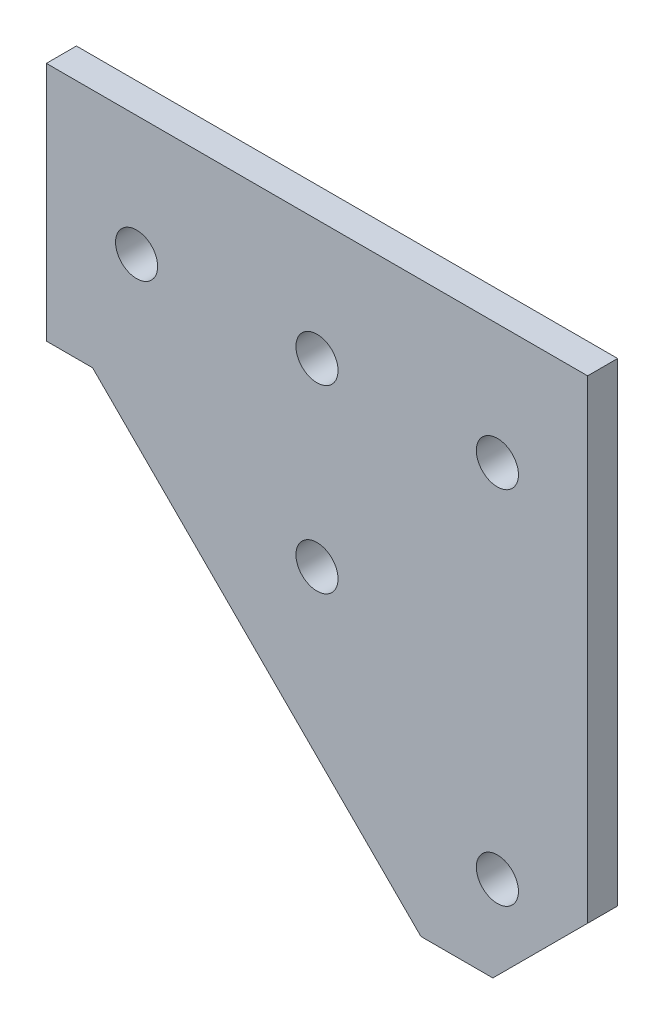
ISO-10303-21;
HEADER;
FILE_DESCRIPTION(('STEP AP214'),'2;1');
FILE_NAME('part.step','',(''),(''),'','','');
FILE_SCHEMA(('AUTOMOTIVE_DESIGN { 1 0 10303 214 1 1 1 1 }'));
ENDSEC;
DATA;
#1=APPLICATION_CONTEXT('core data for automotive mechanical design processes');
#2=APPLICATION_PROTOCOL_DEFINITION('international standard','automotive_design',2000,#1);
#3=PRODUCT_CONTEXT('',#1,'mechanical');
#4=PRODUCT('Part','Part','',(#3));
#5=PRODUCT_RELATED_PRODUCT_CATEGORY('part','',(#4));
#6=PRODUCT_DEFINITION_FORMATION('','',#4);
#7=PRODUCT_DEFINITION_CONTEXT('part definition',#1,'design');
#8=PRODUCT_DEFINITION('design','',#6,#7);
#9=PRODUCT_DEFINITION_SHAPE('','',#8);
#10=(LENGTH_UNIT() NAMED_UNIT(*) SI_UNIT(.MILLI.,.METRE.));
#11=(NAMED_UNIT(*) PLANE_ANGLE_UNIT() SI_UNIT($,.RADIAN.));
#12=(NAMED_UNIT(*) SI_UNIT($,.STERADIAN.) SOLID_ANGLE_UNIT());
#13=UNCERTAINTY_MEASURE_WITH_UNIT(LENGTH_MEASURE(1.E-05),#10,'distance_accuracy_value','');
#14=(GEOMETRIC_REPRESENTATION_CONTEXT(3) GLOBAL_UNCERTAINTY_ASSIGNED_CONTEXT((#13)) GLOBAL_UNIT_ASSIGNED_CONTEXT((#10,
#11,#12)) REPRESENTATION_CONTEXT('',''));
#15=CARTESIAN_POINT('',(0.,0.,0.));
#16=DIRECTION('',(0.,0.,1.));
#17=DIRECTION('',(1.,0.,0.));
#18=AXIS2_PLACEMENT_3D('',#15,#16,#17);
#19=CARTESIAN_POINT('',(0.,0.,2.49900007247925));
#20=DIRECTION('',(0.,0.,-1.));
#21=DIRECTION('',(-1.,0.,0.));
#22=AXIS2_PLACEMENT_3D('',#19,#20,#21);
#23=PLANE('',#22);
#24=CARTESIAN_POINT('',(15.0009994506836,-16.3500003814697,2.49900007247925));
#25=DIRECTION('',(0.,0.,1.));
#26=DIRECTION('',(1.,0.,0.));
#27=AXIS2_PLACEMENT_3D('',#24,#25,#26);
#28=CIRCLE('',#27,1.75);
#29=CARTESIAN_POINT('',(16.7509994506836,-16.3500003814697,2.49900007247925));
#30=VERTEX_POINT('',#29);
#31=EDGE_CURVE('E290',#30,#30,#28,.T.);
#32=ORIENTED_EDGE('',*,*,#31,.F.);
#33=EDGE_LOOP('',(#32));
#34=FACE_BOUND('',#33,.T.);
#35=CARTESIAN_POINT('',(15.0009994506836,13.6499996185303,2.49900007247925));
#36=DIRECTION('',(0.,0.,1.));
#37=DIRECTION('',(1.,0.,0.));
#38=AXIS2_PLACEMENT_3D('',#35,#36,#37);
#39=CIRCLE('',#38,1.75);
#40=CARTESIAN_POINT('',(16.7509994506836,13.6499996185303,2.49900007247925));
#41=VERTEX_POINT('',#40);
#42=EDGE_CURVE('E284',#41,#41,#39,.T.);
#43=ORIENTED_EDGE('',*,*,#42,.F.);
#44=EDGE_LOOP('',(#43));
#45=FACE_BOUND('',#44,.T.);
#46=CARTESIAN_POINT('',(0.000999450683597974,-1.35000038146973,2.49900007247925));
#47=DIRECTION('',(0.,0.,1.));
#48=DIRECTION('',(1.,0.,0.));
#49=AXIS2_PLACEMENT_3D('',#46,#47,#48);
#50=CIRCLE('',#49,1.75);
#51=CARTESIAN_POINT('',(1.7509994506836,-1.35000038146973,2.49900007247925));
#52=VERTEX_POINT('',#51);
#53=EDGE_CURVE('E278',#52,#52,#50,.T.);
#54=ORIENTED_EDGE('',*,*,#53,.F.);
#55=EDGE_LOOP('',(#54));
#56=FACE_BOUND('',#55,.T.);
#57=CARTESIAN_POINT('',(-14.9990005493164,13.6499996185303,2.49900007247925));
#58=DIRECTION('',(0.,0.,1.));
#59=DIRECTION('',(1.,0.,0.));
#60=AXIS2_PLACEMENT_3D('',#57,#58,#59);
#61=CIRCLE('',#60,1.75);
#62=CARTESIAN_POINT('',(-13.2490005493164,13.6499996185303,2.49900007247925));
#63=VERTEX_POINT('',#62);
#64=EDGE_CURVE('E272',#63,#63,#61,.T.);
#65=ORIENTED_EDGE('',*,*,#64,.F.);
#66=EDGE_LOOP('',(#65));
#67=FACE_BOUND('',#66,.T.);
#68=CARTESIAN_POINT('',(0.000999450683596137,13.6499996185303,2.49900007247925));
#69=DIRECTION('',(0.,0.,1.));
#70=DIRECTION('',(1.,0.,0.));
#71=AXIS2_PLACEMENT_3D('',#68,#69,#70);
#72=CIRCLE('',#71,1.75);
#73=CARTESIAN_POINT('',(1.7509994506836,13.6499996185303,2.49900007247925));
#74=VERTEX_POINT('',#73);
#75=EDGE_CURVE('E266',#74,#74,#72,.T.);
#76=ORIENTED_EDGE('',*,*,#75,.F.);
#77=EDGE_LOOP('',(#76));
#78=FACE_BOUND('',#77,.T.);
#79=DIRECTION('',(0.,1.,0.));
#80=VECTOR('',#79,1.);
#81=CARTESIAN_POINT('',(22.5009994506836,-15.7729997634888,2.49900007247925));
#82=LINE('',#81,#80);
#83=CARTESIAN_POINT('',(22.5009994506836,-15.7729997634888,2.49900007247925));
#84=VERTEX_POINT('',#83);
#85=CARTESIAN_POINT('',(22.5009994506836,23.6499996185303,2.49900007247925));
#86=VERTEX_POINT('',#85);
#87=EDGE_CURVE('E92',#84,#86,#82,.T.);
#88=ORIENTED_EDGE('',*,*,#87,.T.);
#89=DIRECTION('',(1.,0.,0.));
#90=VECTOR('',#89,1.);
#91=CARTESIAN_POINT('',(22.5009994506836,23.6499996185303,2.49900007247925));
#92=LINE('',#91,#90);
#93=CARTESIAN_POINT('',(-22.5009994506836,23.6499996185303,2.49900007247925));
#94=VERTEX_POINT('',#93);
#95=EDGE_CURVE('E245',#94,#86,#92,.T.);
#96=ORIENTED_EDGE('',*,*,#95,.F.);
#97=DIRECTION('',(0.,1.,0.));
#98=VECTOR('',#97,1.);
#99=CARTESIAN_POINT('',(-22.5009994506836,23.6499996185303,2.49900007247925));
#100=LINE('',#99,#98);
#101=CARTESIAN_POINT('',(-22.5009994506836,3.65000009536743,2.49900007247925));
#102=VERTEX_POINT('',#101);
#103=EDGE_CURVE('E262',#102,#94,#100,.T.);
#104=ORIENTED_EDGE('',*,*,#103,.F.);
#105=DIRECTION('',(1.,0.,0.));
#106=VECTOR('',#105,1.);
#107=CARTESIAN_POINT('',(-22.5009994506836,3.65000009536743,2.49900007247925));
#108=LINE('',#107,#106);
#109=CARTESIAN_POINT('',(-18.6580009460449,3.65000009536743,2.49900007247925));
#110=VERTEX_POINT('',#109);
#111=EDGE_CURVE('E126',#102,#110,#108,.T.);
#112=ORIENTED_EDGE('',*,*,#111,.T.);
#113=DIRECTION('',(-0.707093843447079,0.707119718689302,0.));
#114=VECTOR('',#113,1.);
#115=CARTESIAN_POINT('',(8.64099979400635,-23.6499996185303,2.49900007247925));
#116=LINE('',#115,#114);
#117=CARTESIAN_POINT('',(8.64099979400635,-23.6499996185303,2.49900007247925));
#118=VERTEX_POINT('',#117);
#119=EDGE_CURVE('E123',#118,#110,#116,.T.);
#120=ORIENTED_EDGE('',*,*,#119,.F.);
#121=DIRECTION('',(-1.,0.,0.));
#122=VECTOR('',#121,1.);
#123=CARTESIAN_POINT('',(14.6230001449585,-23.6499996185303,2.49900007247925));
#124=LINE('',#123,#122);
#125=CARTESIAN_POINT('',(14.6230001449585,-23.6499996185303,2.49900007247925));
#126=VERTEX_POINT('',#125);
#127=EDGE_CURVE('E108',#126,#118,#124,.T.);
#128=ORIENTED_EDGE('',*,*,#127,.F.);
#129=DIRECTION('',(-0.707151636532532,-0.707061922994982,0.));
#130=VECTOR('',#129,1.);
#131=CARTESIAN_POINT('',(22.5009994506836,-15.7729997634888,2.49900007247925));
#132=LINE('',#131,#130);
#133=EDGE_CURVE('E214',#84,#126,#132,.T.);
#134=ORIENTED_EDGE('',*,*,#133,.F.);
#135=EDGE_LOOP('',(#88,#96,#104,#112,#120,#128,#134));
#136=FACE_BOUND('',#135,.T.);
#137=ADVANCED_FACE('F38',(#34,#45,#56,#67,#78,#136),#23,.F.);
#138=CARTESIAN_POINT('',(0.,0.,0.00100000004749745));
#139=DIRECTION('',(0.,0.,1.));
#140=DIRECTION('',(1.,0.,0.));
#141=AXIS2_PLACEMENT_3D('',#138,#139,#140);
#142=PLANE('',#141);
#143=CARTESIAN_POINT('',(15.0009994506836,-16.3500003814697,0.0010000000474973));
#144=DIRECTION('',(0.,0.,1.));
#145=DIRECTION('',(1.,0.,0.));
#146=AXIS2_PLACEMENT_3D('',#143,#144,#145);
#147=CIRCLE('',#146,1.75);
#148=CARTESIAN_POINT('',(16.7509994506836,-16.3500003814697,0.0010000000474973));
#149=VERTEX_POINT('',#148);
#150=EDGE_CURVE('E287',#149,#149,#147,.T.);
#151=ORIENTED_EDGE('',*,*,#150,.T.);
#152=EDGE_LOOP('',(#151));
#153=FACE_BOUND('',#152,.T.);
#154=CARTESIAN_POINT('',(15.0009994506836,13.6499996185303,0.0010000000474973));
#155=DIRECTION('',(0.,0.,1.));
#156=DIRECTION('',(1.,0.,0.));
#157=AXIS2_PLACEMENT_3D('',#154,#155,#156);
#158=CIRCLE('',#157,1.75);
#159=CARTESIAN_POINT('',(16.7509994506836,13.6499996185303,0.0010000000474973));
#160=VERTEX_POINT('',#159);
#161=EDGE_CURVE('E281',#160,#160,#158,.T.);
#162=ORIENTED_EDGE('',*,*,#161,.T.);
#163=EDGE_LOOP('',(#162));
#164=FACE_BOUND('',#163,.T.);
#165=CARTESIAN_POINT('',(0.000999450683597974,-1.35000038146973,0.0010000000474973));
#166=DIRECTION('',(0.,0.,1.));
#167=DIRECTION('',(1.,0.,0.));
#168=AXIS2_PLACEMENT_3D('',#165,#166,#167);
#169=CIRCLE('',#168,1.75);
#170=CARTESIAN_POINT('',(1.7509994506836,-1.35000038146973,0.0010000000474973));
#171=VERTEX_POINT('',#170);
#172=EDGE_CURVE('E275',#171,#171,#169,.T.);
#173=ORIENTED_EDGE('',*,*,#172,.T.);
#174=EDGE_LOOP('',(#173));
#175=FACE_BOUND('',#174,.T.);
#176=CARTESIAN_POINT('',(-14.9990005493164,13.6499996185303,0.0010000000474973));
#177=DIRECTION('',(0.,0.,1.));
#178=DIRECTION('',(1.,0.,0.));
#179=AXIS2_PLACEMENT_3D('',#176,#177,#178);
#180=CIRCLE('',#179,1.75);
#181=CARTESIAN_POINT('',(-13.2490005493164,13.6499996185303,0.0010000000474973));
#182=VERTEX_POINT('',#181);
#183=EDGE_CURVE('E269',#182,#182,#180,.T.);
#184=ORIENTED_EDGE('',*,*,#183,.T.);
#185=EDGE_LOOP('',(#184));
#186=FACE_BOUND('',#185,.T.);
#187=CARTESIAN_POINT('',(0.000999450683596137,13.6499996185303,0.0010000000474973));
#188=DIRECTION('',(0.,0.,1.));
#189=DIRECTION('',(1.,0.,0.));
#190=AXIS2_PLACEMENT_3D('',#187,#188,#189);
#191=CIRCLE('',#190,1.75);
#192=CARTESIAN_POINT('',(1.7509994506836,13.6499996185303,0.0010000000474973));
#193=VERTEX_POINT('',#192);
#194=EDGE_CURVE('E265',#193,#193,#191,.T.);
#195=ORIENTED_EDGE('',*,*,#194,.T.);
#196=EDGE_LOOP('',(#195));
#197=FACE_BOUND('',#196,.T.);
#198=DIRECTION('',(0.707087188626439,-0.707126373203799,0.));
#199=VECTOR('',#198,1.);
#200=CARTESIAN_POINT('',(-18.6580009460449,3.65000009536743,0.00100000004749745));
#201=LINE('',#200,#199);
#202=CARTESIAN_POINT('',(-18.6580009460449,3.65000009536743,0.00100000004749744));
#203=VERTEX_POINT('',#202);
#204=CARTESIAN_POINT('',(-14.1610507965088,-0.847199261188507,0.00100000004749744));
#205=VERTEX_POINT('',#204);
#206=EDGE_CURVE('E198',#203,#205,#201,.T.);
#207=ORIENTED_EDGE('',*,*,#206,.F.);
#208=DIRECTION('',(1.,0.,0.));
#209=VECTOR('',#208,1.);
#210=CARTESIAN_POINT('',(-22.5009994506836,3.65000009536743,0.00100000004749744));
#211=LINE('',#210,#209);
#212=CARTESIAN_POINT('',(-22.5009994506836,3.65000009536743,0.00100000004749744));
#213=VERTEX_POINT('',#212);
#214=EDGE_CURVE('E250',#213,#203,#211,.T.);
#215=ORIENTED_EDGE('',*,*,#214,.F.);
#216=DIRECTION('',(0.,-1.,0.));
#217=VECTOR('',#216,1.);
#218=CARTESIAN_POINT('',(-22.5009994506836,3.65000009536743,0.00100000004749744));
#219=LINE('',#218,#217);
#220=CARTESIAN_POINT('',(-22.5009994506836,23.6499996185303,0.00100000004749745));
#221=VERTEX_POINT('',#220);
#222=EDGE_CURVE('E257',#221,#213,#219,.T.);
#223=ORIENTED_EDGE('',*,*,#222,.F.);
#224=DIRECTION('',(-1.,0.,0.));
#225=VECTOR('',#224,1.);
#226=CARTESIAN_POINT('',(-18.6580009460449,23.6499996185303,0.00100000004749745));
#227=LINE('',#226,#225);
#228=CARTESIAN_POINT('',(22.5009994506836,23.6499996185303,0.00100000004749743));
#229=VERTEX_POINT('',#228);
#230=EDGE_CURVE('E234',#229,#221,#227,.T.);
#231=ORIENTED_EDGE('',*,*,#230,.F.);
#232=DIRECTION('',(0.,1.,0.));
#233=VECTOR('',#232,1.);
#234=CARTESIAN_POINT('',(22.5009994506836,-15.7729997634888,0.00100000004749745));
#235=LINE('',#234,#233);
#236=CARTESIAN_POINT('',(22.5009994506836,-15.7729997634888,0.00100000004749743));
#237=VERTEX_POINT('',#236);
#238=EDGE_CURVE('E42',#237,#229,#235,.T.);
#239=ORIENTED_EDGE('',*,*,#238,.F.);
#240=DIRECTION('',(0.707151636532532,0.707061922994982,0.));
#241=VECTOR('',#240,1.);
#242=CARTESIAN_POINT('',(14.6230001449585,-23.6499996185303,0.00100000004749745));
#243=LINE('',#242,#241);
#244=CARTESIAN_POINT('',(14.6230001449585,-23.6499996185303,0.00100000004749741));
#245=VERTEX_POINT('',#244);
#246=EDGE_CURVE('E119',#245,#237,#243,.T.);
#247=ORIENTED_EDGE('',*,*,#246,.F.);
#248=DIRECTION('',(1.,0.,0.));
#249=VECTOR('',#248,1.);
#250=CARTESIAN_POINT('',(8.64099979400635,-23.6499996185303,0.00100000004749745));
#251=LINE('',#250,#249);
#252=CARTESIAN_POINT('',(8.64099979400635,-23.6499996185303,0.00100000004749743));
#253=VERTEX_POINT('',#252);
#254=EDGE_CURVE('E188',#253,#245,#251,.T.);
#255=ORIENTED_EDGE('',*,*,#254,.F.);
#256=DIRECTION('',(0.707055212201204,-0.707158346411262,0.));
#257=VECTOR('',#256,1.);
#258=CARTESIAN_POINT('',(6.93129014968872,-21.9400405883789,0.00100000004749745));
#259=LINE('',#258,#257);
#260=CARTESIAN_POINT('',(6.93129014968872,-21.9400405883789,0.00100000004749745));
#261=VERTEX_POINT('',#260);
#262=EDGE_CURVE('E139',#261,#253,#259,.T.);
#263=ORIENTED_EDGE('',*,*,#262,.F.);
#264=DIRECTION('',(0.707289456048854,-0.706924059119589,0.));
#265=VECTOR('',#264,1.);
#266=CARTESIAN_POINT('',(6.4494833946228,-21.4584827423096,0.00100000004749745));
#267=LINE('',#266,#265);
#268=CARTESIAN_POINT('',(6.4494833946228,-21.4584827423096,0.00100000004749741));
#269=VERTEX_POINT('',#268);
#270=EDGE_CURVE('E59',#269,#261,#267,.T.);
#271=ORIENTED_EDGE('',*,*,#270,.F.);
#272=DIRECTION('',(0.706819040544871,-0.707394404786487,0.));
#273=VECTOR('',#272,1.);
#274=CARTESIAN_POINT('',(6.08981370925903,-21.0985202789307,0.00100000004749745));
#275=LINE('',#274,#273);
#276=CARTESIAN_POINT('',(6.08981370925903,-21.0985202789307,0.00100000004749743));
#277=VERTEX_POINT('',#276);
#278=EDGE_CURVE('E12',#277,#269,#275,.T.);
#279=ORIENTED_EDGE('',*,*,#278,.F.);
#280=DIRECTION('',(0.707093827171199,-0.707119734964586,0.));
#281=VECTOR('',#280,1.);
#282=CARTESIAN_POINT('',(-13.1874361038208,-1.82056415081024,0.00100000004749745));
#283=LINE('',#282,#281);
#284=CARTESIAN_POINT('',(-13.1874361038208,-1.82056415081024,0.00100000004749744));
#285=VERTEX_POINT('',#284);
#286=EDGE_CURVE('E151',#285,#277,#283,.T.);
#287=ORIENTED_EDGE('',*,*,#286,.F.);
#288=DIRECTION('',(0.707197499194438,-0.70701605153853,0.));
#289=VECTOR('',#288,1.);
#290=CARTESIAN_POINT('',(-14.1610507965088,-0.847199261188507,0.00100000004749745));
#291=LINE('',#290,#289);
#292=EDGE_CURVE('E183',#205,#285,#291,.T.);
#293=ORIENTED_EDGE('',*,*,#292,.F.);
#294=EDGE_LOOP('',(#207,#215,#223,#231,#239,#247,#255,#263,#271,#279,#287,#293));
#295=FACE_BOUND('',#294,.T.);
#296=ADVANCED_FACE('F296',(#153,#164,#175,#186,#197,#295),#142,.F.);
#297=CARTESIAN_POINT('',(22.5009994506836,0.,0.));
#298=DIRECTION('',(1.,0.,0.));
#299=DIRECTION('',(0.,0.,-1.));
#300=AXIS2_PLACEMENT_3D('',#297,#298,#299);
#301=PLANE('',#300);
#302=ORIENTED_EDGE('',*,*,#238,.T.);
#303=DIRECTION('',(0.,0.,-1.));
#304=VECTOR('',#303,1.);
#305=CARTESIAN_POINT('',(22.5009994506836,23.6499996185303,0.00100000004749743));
#306=LINE('',#305,#304);
#307=EDGE_CURVE('E239',#86,#229,#306,.T.);
#308=ORIENTED_EDGE('',*,*,#307,.F.);
#309=ORIENTED_EDGE('',*,*,#87,.F.);
#310=DIRECTION('',(0.,0.,1.));
#311=VECTOR('',#310,1.);
#312=CARTESIAN_POINT('',(22.5009994506836,-15.7729997634888,0.00100000004749745));
#313=LINE('',#312,#311);
#314=EDGE_CURVE('E218',#237,#84,#313,.T.);
#315=ORIENTED_EDGE('',*,*,#314,.F.);
#316=EDGE_LOOP('',(#302,#308,#309,#315));
#317=FACE_BOUND('',#316,.T.);
#318=ADVANCED_FACE('F40',(#317),#301,.T.);
#319=CARTESIAN_POINT('',(19.13557214657,-19.138000109121,0.));
#320=DIRECTION('',(0.707061922994982,-0.707151636532532,0.));
#321=DIRECTION('',(0.707151636532532,0.707061922994982,0.));
#322=AXIS2_PLACEMENT_3D('',#319,#320,#321);
#323=PLANE('',#322);
#324=DIRECTION('',(0.,0.,1.));
#325=VECTOR('',#324,1.);
#326=CARTESIAN_POINT('',(14.6230001449585,-23.6499996185303,0.00100000004749745));
#327=LINE('',#326,#325);
#328=EDGE_CURVE('E116',#245,#126,#327,.T.);
#329=ORIENTED_EDGE('',*,*,#328,.F.);
#330=ORIENTED_EDGE('',*,*,#246,.T.);
#331=ORIENTED_EDGE('',*,*,#314,.T.);
#332=ORIENTED_EDGE('',*,*,#133,.T.);
#333=EDGE_LOOP('',(#329,#330,#331,#332));
#334=FACE_BOUND('',#333,.T.);
#335=ADVANCED_FACE('F342',(#334),#323,.T.);
#336=CARTESIAN_POINT('',(-7.50451739806725,-7.50410154405066,0.));
#337=DIRECTION('',(0.707126373203799,0.707087188626439,0.));
#338=DIRECTION('',(-0.707087188626439,0.707126373203799,0.));
#339=AXIS2_PLACEMENT_3D('',#336,#337,#338);
#340=PLANE('',#339);
#341=ORIENTED_EDGE('',*,*,#206,.T.);
#342=DIRECTION('',(0.658140144161474,-0.65817661624555,-0.365588693029027));
#343=VECTOR('',#342,1.);
#344=CARTESIAN_POINT('',(-18.6580009460449,3.65000009536743,2.49900007247925));
#345=LINE('',#344,#343);
#346=EDGE_CURVE('E187',#110,#205,#345,.T.);
#347=ORIENTED_EDGE('',*,*,#346,.F.);
#348=DIRECTION('',(0.,0.,-1.));
#349=VECTOR('',#348,1.);
#350=CARTESIAN_POINT('',(-18.6580009460449,3.65000009536743,2.49900007247925));
#351=LINE('',#350,#349);
#352=EDGE_CURVE('E193',#110,#203,#351,.T.);
#353=ORIENTED_EDGE('',*,*,#352,.T.);
#354=EDGE_LOOP('',(#341,#347,#353));
#355=FACE_BOUND('',#354,.T.);
#356=ADVANCED_FACE('F359',(#355),#340,.F.);
#357=CARTESIAN_POINT('',(0.,-23.6499996185303,0.));
#358=DIRECTION('',(0.,-1.,0.));
#359=DIRECTION('',(0.,0.,-1.));
#360=AXIS2_PLACEMENT_3D('',#357,#358,#359);
#361=PLANE('',#360);
#362=ORIENTED_EDGE('',*,*,#254,.T.);
#363=ORIENTED_EDGE('',*,*,#328,.T.);
#364=ORIENTED_EDGE('',*,*,#127,.T.);
#365=DIRECTION('',(0.,0.,1.));
#366=VECTOR('',#365,1.);
#367=CARTESIAN_POINT('',(8.64099979400635,-23.6499996185303,0.00100000004749745));
#368=LINE('',#367,#366);
#369=EDGE_CURVE('E113',#253,#118,#368,.T.);
#370=ORIENTED_EDGE('',*,*,#369,.F.);
#371=EDGE_LOOP('',(#362,#363,#364,#370));
#372=FACE_BOUND('',#371,.T.);
#373=ADVANCED_FACE('F111',(#372),#361,.T.);
#374=CARTESIAN_POINT('',(-7.5023072087039,-7.50423259081362,0.00421475360320862));
#375=DIRECTION('',(0.707015995767012,0.707197443408606,-0.000397197573064986));
#376=DIRECTION('',(-0.707197499194438,0.70701605153853,0.));
#377=AXIS2_PLACEMENT_3D('',#374,#375,#376);
#378=PLANE('',#377);
#379=ORIENTED_EDGE('',*,*,#292,.T.);
#380=DIRECTION('',(0.672900166017759,-0.672900092701792,-0.307263456686916));
#381=VECTOR('',#380,1.);
#382=CARTESIAN_POINT('',(-18.6580009460449,3.65000009536743,2.49900007247925));
#383=LINE('',#382,#381);
#384=EDGE_CURVE('E132',#110,#285,#383,.T.);
#385=ORIENTED_EDGE('',*,*,#384,.F.);
#386=ORIENTED_EDGE('',*,*,#346,.T.);
#387=EDGE_LOOP('',(#379,#385,#386));
#388=FACE_BOUND('',#387,.T.);
#389=ADVANCED_FACE('F353',(#388),#378,.F.);
#390=CARTESIAN_POINT('',(-7.5038696251632,-7.50277523708153,0.));
#391=DIRECTION('',(-0.707158346411262,-0.707055212201204,0.));
#392=DIRECTION('',(0.707055212201204,-0.707158346411262,0.));
#393=AXIS2_PLACEMENT_3D('',#390,#391,#392);
#394=PLANE('',#393);
#395=DIRECTION('',(0.491769759740235,-0.491841491459096,0.718508490335587));
#396=VECTOR('',#395,1.);
#397=CARTESIAN_POINT('',(6.93129014968872,-21.9400405883789,0.00100000004749745));
#398=LINE('',#397,#396);
#399=EDGE_CURVE('E138',#261,#118,#398,.T.);
#400=ORIENTED_EDGE('',*,*,#399,.F.);
#401=ORIENTED_EDGE('',*,*,#262,.T.);
#402=ORIENTED_EDGE('',*,*,#369,.T.);
#403=EDGE_LOOP('',(#400,#401,#402));
#404=FACE_BOUND('',#403,.T.);
#405=ADVANCED_FACE('F137',(#404),#394,.T.);
#406=CARTESIAN_POINT('',(-7.50616362555368,-7.51004343287379,-0.00340522105267804));
#407=DIRECTION('',(0.706924022766374,0.707289419676849,0.000320700784722148));
#408=DIRECTION('',(-0.707289456048854,0.706924059119589,0.));
#409=AXIS2_PLACEMENT_3D('',#406,#407,#408);
#410=PLANE('',#409);
#411=ORIENTED_EDGE('',*,*,#399,.T.);
#412=DIRECTION('',(0.550543733247143,-0.550543853036211,0.627537300617535));
#413=VECTOR('',#412,1.);
#414=CARTESIAN_POINT('',(6.4494833946228,-21.4584827423096,0.00100000004749745));
#415=LINE('',#414,#413);
#416=EDGE_CURVE('E145',#269,#118,#415,.T.);
#417=ORIENTED_EDGE('',*,*,#416,.F.);
#418=ORIENTED_EDGE('',*,*,#270,.T.);
#419=EDGE_LOOP('',(#411,#417,#418));
#420=FACE_BOUND('',#419,.T.);
#421=ADVANCED_FACE('F143',(#420),#410,.F.);
#422=CARTESIAN_POINT('',(-7.50424165096138,-7.50396670694185,-0.000600136608510047));
#423=DIRECTION('',(0.707119733833917,0.707093826040571,5.65504761989171E-05));
#424=DIRECTION('',(-0.707093827171199,0.707119734964586,0.));
#425=AXIS2_PLACEMENT_3D('',#422,#423,#424);
#426=PLANE('',#425);
#427=DIRECTION('',(-0.581339406138554,0.581406230194509,-0.569219896315549));
#428=VECTOR('',#427,1.);
#429=CARTESIAN_POINT('',(8.64099979400635,-23.6499996185303,2.49900007247925));
#430=LINE('',#429,#428);
#431=EDGE_CURVE('E50',#118,#277,#430,.T.);
#432=ORIENTED_EDGE('',*,*,#431,.F.);
#433=ORIENTED_EDGE('',*,*,#119,.T.);
#434=ORIENTED_EDGE('',*,*,#384,.T.);
#435=ORIENTED_EDGE('',*,*,#286,.T.);
#436=EDGE_LOOP('',(#432,#433,#434,#435));
#437=FACE_BOUND('',#436,.T.);
#438=ADVANCED_FACE('F149',(#437),#426,.F.);
#439=CARTESIAN_POINT('',(-7.50187063542786,-7.49576893589554,0.00535164128919934));
#440=DIRECTION('',(0.707394314714523,0.706818950546168,-0.000504636884098335));
#441=DIRECTION('',(-0.706819040544871,0.707394404786487,0.));
#442=AXIS2_PLACEMENT_3D('',#439,#440,#441);
#443=PLANE('',#442);
#444=ORIENTED_EDGE('',*,*,#416,.T.);
#445=ORIENTED_EDGE('',*,*,#431,.T.);
#446=ORIENTED_EDGE('',*,*,#278,.T.);
#447=EDGE_LOOP('',(#444,#445,#446));
#448=FACE_BOUND('',#447,.T.);
#449=ADVANCED_FACE('F155',(#448),#443,.F.);
#450=CARTESIAN_POINT('',(0.,23.6499996185303,0.));
#451=DIRECTION('',(0.,-1.,0.));
#452=DIRECTION('',(0.,0.,-1.));
#453=AXIS2_PLACEMENT_3D('',#450,#451,#452);
#454=PLANE('',#453);
#455=ORIENTED_EDGE('',*,*,#230,.T.);
#456=DIRECTION('',(0.,0.,-1.));
#457=VECTOR('',#456,1.);
#458=CARTESIAN_POINT('',(-22.5009994506836,23.6499996185303,0.00100000004749745));
#459=LINE('',#458,#457);
#460=EDGE_CURVE('E260',#94,#221,#459,.T.);
#461=ORIENTED_EDGE('',*,*,#460,.F.);
#462=ORIENTED_EDGE('',*,*,#95,.T.);
#463=ORIENTED_EDGE('',*,*,#307,.T.);
#464=EDGE_LOOP('',(#455,#461,#462,#463));
#465=FACE_BOUND('',#464,.T.);
#466=ADVANCED_FACE('F338',(#465),#454,.F.);
#467=CARTESIAN_POINT('',(-22.5009994506836,3.65000009536743,2.49900007247925));
#468=DIRECTION('',(0.,1.,0.));
#469=DIRECTION('',(0.,0.,1.));
#470=AXIS2_PLACEMENT_3D('',#467,#468,#469);
#471=PLANE('',#470);
#472=ORIENTED_EDGE('',*,*,#352,.F.);
#473=ORIENTED_EDGE('',*,*,#111,.F.);
#474=DIRECTION('',(0.,0.,1.));
#475=VECTOR('',#474,1.);
#476=CARTESIAN_POINT('',(-22.5009994506836,3.65000009536743,2.49900007247925));
#477=LINE('',#476,#475);
#478=EDGE_CURVE('E254',#213,#102,#477,.T.);
#479=ORIENTED_EDGE('',*,*,#478,.F.);
#480=ORIENTED_EDGE('',*,*,#214,.T.);
#481=EDGE_LOOP('',(#472,#473,#479,#480));
#482=FACE_BOUND('',#481,.T.);
#483=ADVANCED_FACE('F330',(#482),#471,.F.);
#484=CARTESIAN_POINT('',(-22.5009994506836,0.,0.));
#485=DIRECTION('',(1.,0.,0.));
#486=DIRECTION('',(0.,0.,-1.));
#487=AXIS2_PLACEMENT_3D('',#484,#485,#486);
#488=PLANE('',#487);
#489=ORIENTED_EDGE('',*,*,#103,.T.);
#490=ORIENTED_EDGE('',*,*,#460,.T.);
#491=ORIENTED_EDGE('',*,*,#222,.T.);
#492=ORIENTED_EDGE('',*,*,#478,.T.);
#493=EDGE_LOOP('',(#489,#490,#491,#492));
#494=FACE_BOUND('',#493,.T.);
#495=ADVANCED_FACE('F320',(#494),#488,.F.);
#496=CARTESIAN_POINT('',(0.000999450683596137,13.6499996185303,0.0010000000474973));
#497=DIRECTION('',(0.,0.,1.));
#498=DIRECTION('',(1.,0.,0.));
#499=AXIS2_PLACEMENT_3D('',#496,#497,#498);
#500=CYLINDRICAL_SURFACE('',#499,1.75);
#501=ORIENTED_EDGE('',*,*,#194,.F.);
#502=EDGE_LOOP('',(#501));
#503=FACE_BOUND('',#502,.T.);
#504=ORIENTED_EDGE('',*,*,#75,.T.);
#505=EDGE_LOOP('',(#504));
#506=FACE_BOUND('',#505,.T.);
#507=ADVANCED_FACE('F317',(#503,#506),#500,.F.);
#508=CARTESIAN_POINT('',(-14.9990005493164,13.6499996185303,0.0010000000474973));
#509=DIRECTION('',(0.,0.,1.));
#510=DIRECTION('',(1.,0.,0.));
#511=AXIS2_PLACEMENT_3D('',#508,#509,#510);
#512=CYLINDRICAL_SURFACE('',#511,1.75);
#513=ORIENTED_EDGE('',*,*,#183,.F.);
#514=EDGE_LOOP('',(#513));
#515=FACE_BOUND('',#514,.T.);
#516=ORIENTED_EDGE('',*,*,#64,.T.);
#517=EDGE_LOOP('',(#516));
#518=FACE_BOUND('',#517,.T.);
#519=ADVANCED_FACE('F319',(#515,#518),#512,.F.);
#520=CARTESIAN_POINT('',(0.000999450683597974,-1.35000038146973,0.0010000000474973));
#521=DIRECTION('',(0.,0.,1.));
#522=DIRECTION('',(1.,0.,0.));
#523=AXIS2_PLACEMENT_3D('',#520,#521,#522);
#524=CYLINDRICAL_SURFACE('',#523,1.75);
#525=ORIENTED_EDGE('',*,*,#172,.F.);
#526=EDGE_LOOP('',(#525));
#527=FACE_BOUND('',#526,.T.);
#528=ORIENTED_EDGE('',*,*,#53,.T.);
#529=EDGE_LOOP('',(#528));
#530=FACE_BOUND('',#529,.T.);
#531=ADVANCED_FACE('F327',(#527,#530),#524,.F.);
#532=CARTESIAN_POINT('',(15.0009994506836,13.6499996185303,0.0010000000474973));
#533=DIRECTION('',(0.,0.,1.));
#534=DIRECTION('',(1.,0.,0.));
#535=AXIS2_PLACEMENT_3D('',#532,#533,#534);
#536=CYLINDRICAL_SURFACE('',#535,1.75);
#537=ORIENTED_EDGE('',*,*,#161,.F.);
#538=EDGE_LOOP('',(#537));
#539=FACE_BOUND('',#538,.T.);
#540=ORIENTED_EDGE('',*,*,#42,.T.);
#541=EDGE_LOOP('',(#540));
#542=FACE_BOUND('',#541,.T.);
#543=ADVANCED_FACE('F302',(#539,#542),#536,.F.);
#544=CARTESIAN_POINT('',(15.0009994506836,-16.3500003814697,0.0010000000474973));
#545=DIRECTION('',(0.,0.,1.));
#546=DIRECTION('',(1.,0.,0.));
#547=AXIS2_PLACEMENT_3D('',#544,#545,#546);
#548=CYLINDRICAL_SURFACE('',#547,1.75);
#549=ORIENTED_EDGE('',*,*,#150,.F.);
#550=EDGE_LOOP('',(#549));
#551=FACE_BOUND('',#550,.T.);
#552=ORIENTED_EDGE('',*,*,#31,.T.);
#553=EDGE_LOOP('',(#552));
#554=FACE_BOUND('',#553,.T.);
#555=ADVANCED_FACE('F299',(#551,#554),#548,.F.);
#556=CLOSED_SHELL('',(#137,#296,#318,#335,#356,#373,#389,#405,#421,#438,#449,#466,#483,#495,
#507,#519,#531,#543,#555));
#557=MANIFOLD_SOLID_BREP('B2',#556);
#558=ADVANCED_BREP_SHAPE_REPRESENTATION('',(#18,#557),#14);
#559=SHAPE_DEFINITION_REPRESENTATION(#9,#558);
ENDSEC;
END-ISO-10303-21;
